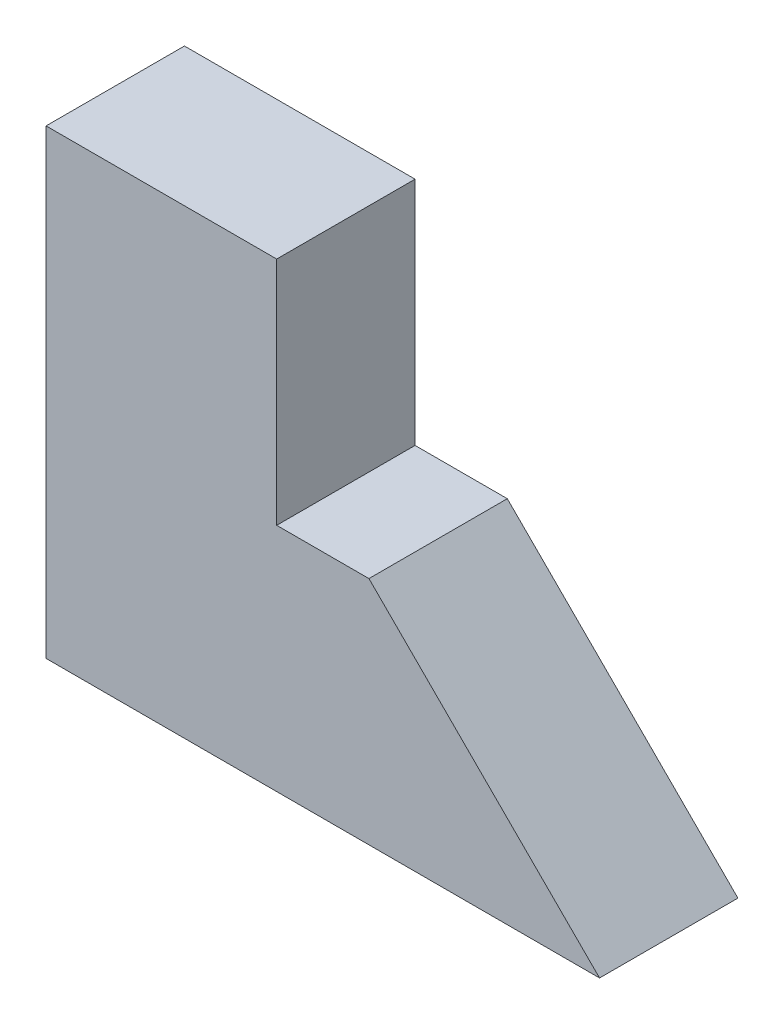
ISO-10303-21;
HEADER;
FILE_DESCRIPTION(('STEP AP214'),'2;1');
FILE_NAME('part.step','',(''),(''),'','','');
FILE_SCHEMA(('AUTOMOTIVE_DESIGN { 1 0 10303 214 1 1 1 1 }'));
ENDSEC;
DATA;
#1=APPLICATION_CONTEXT('core data for automotive mechanical design processes');
#2=APPLICATION_PROTOCOL_DEFINITION('international standard','automotive_design',2000,#1);
#3=PRODUCT_CONTEXT('',#1,'mechanical');
#4=PRODUCT('Part','Part','',(#3));
#5=PRODUCT_RELATED_PRODUCT_CATEGORY('part','',(#4));
#6=PRODUCT_DEFINITION_FORMATION('','',#4);
#7=PRODUCT_DEFINITION_CONTEXT('part definition',#1,'design');
#8=PRODUCT_DEFINITION('design','',#6,#7);
#9=PRODUCT_DEFINITION_SHAPE('','',#8);
#10=(LENGTH_UNIT() NAMED_UNIT(*) SI_UNIT(.MILLI.,.METRE.));
#11=(NAMED_UNIT(*) PLANE_ANGLE_UNIT() SI_UNIT($,.RADIAN.));
#12=(NAMED_UNIT(*) SI_UNIT($,.STERADIAN.) SOLID_ANGLE_UNIT());
#13=UNCERTAINTY_MEASURE_WITH_UNIT(LENGTH_MEASURE(1.E-05),#10,'distance_accuracy_value','');
#14=(GEOMETRIC_REPRESENTATION_CONTEXT(3) GLOBAL_UNCERTAINTY_ASSIGNED_CONTEXT((#13)) GLOBAL_UNIT_ASSIGNED_CONTEXT((#10,
#11,#12)) REPRESENTATION_CONTEXT('',''));
#15=CARTESIAN_POINT('',(0.,0.,0.));
#16=DIRECTION('',(0.,0.,1.));
#17=DIRECTION('',(1.,0.,0.));
#18=AXIS2_PLACEMENT_3D('',#15,#16,#17);
#19=CARTESIAN_POINT('',(0.,0.,3.));
#20=DIRECTION('',(-1.,0.,0.));
#21=DIRECTION('',(0.,0.,1.));
#22=AXIS2_PLACEMENT_3D('',#19,#20,#21);
#23=PLANE('',#22);
#24=DIRECTION('',(0.,1.,0.));
#25=VECTOR('',#24,1.);
#26=CARTESIAN_POINT('',(0.,0.,0.));
#27=LINE('',#26,#25);
#28=CARTESIAN_POINT('',(0.,0.,0.));
#29=VERTEX_POINT('',#28);
#30=CARTESIAN_POINT('',(0.,5.,0.));
#31=VERTEX_POINT('',#30);
#32=EDGE_CURVE('E134',#29,#31,#27,.T.);
#33=ORIENTED_EDGE('',*,*,#32,.T.);
#34=DIRECTION('',(0.,0.,-1.));
#35=VECTOR('',#34,1.);
#36=CARTESIAN_POINT('',(0.,5.,3.));
#37=LINE('',#36,#35);
#38=CARTESIAN_POINT('',(0.,5.,3.));
#39=VERTEX_POINT('',#38);
#40=EDGE_CURVE('E11',#39,#31,#37,.T.);
#41=ORIENTED_EDGE('',*,*,#40,.F.);
#42=DIRECTION('',(0.,1.,0.));
#43=VECTOR('',#42,1.);
#44=CARTESIAN_POINT('',(0.,0.,3.));
#45=LINE('',#44,#43);
#46=CARTESIAN_POINT('',(0.,0.,3.));
#47=VERTEX_POINT('',#46);
#48=EDGE_CURVE('E150',#47,#39,#45,.T.);
#49=ORIENTED_EDGE('',*,*,#48,.F.);
#50=DIRECTION('',(0.,0.,-1.));
#51=VECTOR('',#50,1.);
#52=CARTESIAN_POINT('',(0.,0.,3.));
#53=LINE('',#52,#51);
#54=EDGE_CURVE('E130',#47,#29,#53,.T.);
#55=ORIENTED_EDGE('',*,*,#54,.T.);
#56=EDGE_LOOP('',(#33,#41,#49,#55));
#57=FACE_BOUND('',#56,.T.);
#58=ADVANCED_FACE('F45',(#57),#23,.F.);
#59=CARTESIAN_POINT('',(0.,5.,3.));
#60=DIRECTION('',(0.,-1.,0.));
#61=DIRECTION('',(1.,0.,0.));
#62=AXIS2_PLACEMENT_3D('',#59,#60,#61);
#63=PLANE('',#62);
#64=DIRECTION('',(-1.,0.,0.));
#65=VECTOR('',#64,1.);
#66=CARTESIAN_POINT('',(0.,5.,0.));
#67=LINE('',#66,#65);
#68=CARTESIAN_POINT('',(-5.00000000000012,4.99999999999988,0.));
#69=VERTEX_POINT('',#68);
#70=EDGE_CURVE('E138',#31,#69,#67,.T.);
#71=ORIENTED_EDGE('',*,*,#70,.T.);
#72=DIRECTION('',(0.,0.,-1.));
#73=VECTOR('',#72,1.);
#74=CARTESIAN_POINT('',(-5.00000000000012,4.99999999999988,3.));
#75=LINE('',#74,#73);
#76=CARTESIAN_POINT('',(-5.00000000000012,4.99999999999988,3.));
#77=VERTEX_POINT('',#76);
#78=EDGE_CURVE('E54',#77,#69,#75,.T.);
#79=ORIENTED_EDGE('',*,*,#78,.F.);
#80=DIRECTION('',(-1.,0.,0.));
#81=VECTOR('',#80,1.);
#82=CARTESIAN_POINT('',(0.,5.,3.));
#83=LINE('',#82,#81);
#84=EDGE_CURVE('E99',#39,#77,#83,.T.);
#85=ORIENTED_EDGE('',*,*,#84,.F.);
#86=ORIENTED_EDGE('',*,*,#40,.T.);
#87=EDGE_LOOP('',(#71,#79,#85,#86));
#88=FACE_BOUND('',#87,.T.);
#89=ADVANCED_FACE('F178',(#88),#63,.F.);
#90=CARTESIAN_POINT('',(-5.00000000000012,4.99999999999988,3.));
#91=DIRECTION('',(1.,0.,0.));
#92=DIRECTION('',(0.,1.,0.));
#93=AXIS2_PLACEMENT_3D('',#90,#91,#92);
#94=PLANE('',#93);
#95=DIRECTION('',(0.,-1.,0.));
#96=VECTOR('',#95,1.);
#97=CARTESIAN_POINT('',(-5.00000000000012,4.99999999999988,0.));
#98=LINE('',#97,#96);
#99=CARTESIAN_POINT('',(-5.00000000000012,-5.00000000000006,0.));
#100=VERTEX_POINT('',#99);
#101=EDGE_CURVE('E141',#69,#100,#98,.T.);
#102=ORIENTED_EDGE('',*,*,#101,.T.);
#103=DIRECTION('',(0.,0.,-1.));
#104=VECTOR('',#103,1.);
#105=CARTESIAN_POINT('',(-5.00000000000012,-5.00000000000006,3.));
#106=LINE('',#105,#104);
#107=CARTESIAN_POINT('',(-5.00000000000012,-5.00000000000006,3.));
#108=VERTEX_POINT('',#107);
#109=EDGE_CURVE('E123',#108,#100,#106,.T.);
#110=ORIENTED_EDGE('',*,*,#109,.F.);
#111=DIRECTION('',(0.,-1.,0.));
#112=VECTOR('',#111,1.);
#113=CARTESIAN_POINT('',(-5.00000000000012,4.99999999999988,3.));
#114=LINE('',#113,#112);
#115=EDGE_CURVE('E112',#77,#108,#114,.T.);
#116=ORIENTED_EDGE('',*,*,#115,.F.);
#117=ORIENTED_EDGE('',*,*,#78,.T.);
#118=EDGE_LOOP('',(#102,#110,#116,#117));
#119=FACE_BOUND('',#118,.T.);
#120=ADVANCED_FACE('F160',(#119),#94,.F.);
#121=CARTESIAN_POINT('',(-5.00000000000012,-5.00000000000006,3.));
#122=DIRECTION('',(0.,1.,0.));
#123=DIRECTION('',(-1.,0.,0.));
#124=AXIS2_PLACEMENT_3D('',#121,#122,#123);
#125=PLANE('',#124);
#126=DIRECTION('',(1.,0.,0.));
#127=VECTOR('',#126,1.);
#128=CARTESIAN_POINT('',(-5.00000000000012,-5.00000000000006,0.));
#129=LINE('',#128,#127);
#130=CARTESIAN_POINT('',(7.00000000000012,-5.,0.));
#131=VERTEX_POINT('',#130);
#132=EDGE_CURVE('E121',#100,#131,#129,.T.);
#133=ORIENTED_EDGE('',*,*,#132,.T.);
#134=DIRECTION('',(0.,0.,-1.));
#135=VECTOR('',#134,1.);
#136=CARTESIAN_POINT('',(7.00000000000012,-5.,3.));
#137=LINE('',#136,#135);
#138=CARTESIAN_POINT('',(7.00000000000012,-5.,3.));
#139=VERTEX_POINT('',#138);
#140=EDGE_CURVE('E118',#139,#131,#137,.T.);
#141=ORIENTED_EDGE('',*,*,#140,.F.);
#142=DIRECTION('',(1.,0.,0.));
#143=VECTOR('',#142,1.);
#144=CARTESIAN_POINT('',(-5.00000000000012,-5.00000000000006,3.));
#145=LINE('',#144,#143);
#146=EDGE_CURVE('E106',#108,#139,#145,.T.);
#147=ORIENTED_EDGE('',*,*,#146,.F.);
#148=ORIENTED_EDGE('',*,*,#109,.T.);
#149=EDGE_LOOP('',(#133,#141,#147,#148));
#150=FACE_BOUND('',#149,.T.);
#151=ADVANCED_FACE('F119',(#150),#125,.F.);
#152=CARTESIAN_POINT('',(2.,0.,3.));
#153=DIRECTION('',(-0.707106781186539,-0.707106781186556,0.));
#154=DIRECTION('',(0.707106781186556,-0.707106781186539,0.));
#155=AXIS2_PLACEMENT_3D('',#152,#153,#154);
#156=PLANE('',#155);
#157=DIRECTION('',(-0.707106781186556,0.707106781186539,0.));
#158=VECTOR('',#157,1.);
#159=CARTESIAN_POINT('',(2.,0.,0.));
#160=LINE('',#159,#158);
#161=CARTESIAN_POINT('',(2.,0.,0.));
#162=VERTEX_POINT('',#161);
#163=EDGE_CURVE('E85',#131,#162,#160,.T.);
#164=ORIENTED_EDGE('',*,*,#163,.T.);
#165=DIRECTION('',(0.,0.,-1.));
#166=VECTOR('',#165,1.);
#167=CARTESIAN_POINT('',(2.,0.,3.));
#168=LINE('',#167,#166);
#169=CARTESIAN_POINT('',(2.,0.,3.));
#170=VERTEX_POINT('',#169);
#171=EDGE_CURVE('E124',#170,#162,#168,.T.);
#172=ORIENTED_EDGE('',*,*,#171,.F.);
#173=DIRECTION('',(-0.707106781186556,0.707106781186539,0.));
#174=VECTOR('',#173,1.);
#175=CARTESIAN_POINT('',(2.,0.,3.));
#176=LINE('',#175,#174);
#177=EDGE_CURVE('E110',#139,#170,#176,.T.);
#178=ORIENTED_EDGE('',*,*,#177,.F.);
#179=ORIENTED_EDGE('',*,*,#140,.T.);
#180=EDGE_LOOP('',(#164,#172,#178,#179));
#181=FACE_BOUND('',#180,.T.);
#182=ADVANCED_FACE('F126',(#181),#156,.F.);
#183=CARTESIAN_POINT('',(0.,0.,3.));
#184=DIRECTION('',(0.,-1.,0.));
#185=DIRECTION('',(0.,0.,-1.));
#186=AXIS2_PLACEMENT_3D('',#183,#184,#185);
#187=PLANE('',#186);
#188=DIRECTION('',(-1.,0.,0.));
#189=VECTOR('',#188,1.);
#190=CARTESIAN_POINT('',(0.,0.,0.));
#191=LINE('',#190,#189);
#192=EDGE_CURVE('E91',#162,#29,#191,.T.);
#193=ORIENTED_EDGE('',*,*,#192,.T.);
#194=ORIENTED_EDGE('',*,*,#54,.F.);
#195=DIRECTION('',(-1.,0.,0.));
#196=VECTOR('',#195,1.);
#197=CARTESIAN_POINT('',(0.,0.,3.));
#198=LINE('',#197,#196);
#199=EDGE_CURVE('E62',#170,#47,#198,.T.);
#200=ORIENTED_EDGE('',*,*,#199,.F.);
#201=ORIENTED_EDGE('',*,*,#171,.T.);
#202=EDGE_LOOP('',(#193,#194,#200,#201));
#203=FACE_BOUND('',#202,.T.);
#204=ADVANCED_FACE('F167',(#203),#187,.F.);
#205=CARTESIAN_POINT('',(0.,0.,3.));
#206=DIRECTION('',(0.,0.,1.));
#207=DIRECTION('',(1.,0.,0.));
#208=AXIS2_PLACEMENT_3D('',#205,#206,#207);
#209=PLANE('',#208);
#210=ORIENTED_EDGE('',*,*,#48,.T.);
#211=ORIENTED_EDGE('',*,*,#84,.T.);
#212=ORIENTED_EDGE('',*,*,#115,.T.);
#213=ORIENTED_EDGE('',*,*,#146,.T.);
#214=ORIENTED_EDGE('',*,*,#177,.T.);
#215=ORIENTED_EDGE('',*,*,#199,.T.);
#216=EDGE_LOOP('',(#210,#211,#212,#213,#214,#215));
#217=FACE_BOUND('',#216,.T.);
#218=ADVANCED_FACE('F108',(#217),#209,.T.);
#219=CARTESIAN_POINT('',(0.,0.,0.));
#220=DIRECTION('',(0.,0.,1.));
#221=DIRECTION('',(1.,0.,0.));
#222=AXIS2_PLACEMENT_3D('',#219,#220,#221);
#223=PLANE('',#222);
#224=ORIENTED_EDGE('',*,*,#32,.F.);
#225=ORIENTED_EDGE('',*,*,#192,.F.);
#226=ORIENTED_EDGE('',*,*,#163,.F.);
#227=ORIENTED_EDGE('',*,*,#132,.F.);
#228=ORIENTED_EDGE('',*,*,#101,.F.);
#229=ORIENTED_EDGE('',*,*,#70,.F.);
#230=EDGE_LOOP('',(#224,#225,#226,#227,#228,#229));
#231=FACE_BOUND('',#230,.T.);
#232=ADVANCED_FACE('F163',(#231),#223,.F.);
#233=CLOSED_SHELL('',(#58,#89,#120,#151,#182,#204,#218,#232));
#234=MANIFOLD_SOLID_BREP('B2',#233);
#235=ADVANCED_BREP_SHAPE_REPRESENTATION('',(#18,#234),#14);
#236=SHAPE_DEFINITION_REPRESENTATION(#9,#235);
ENDSEC;
END-ISO-10303-21;
